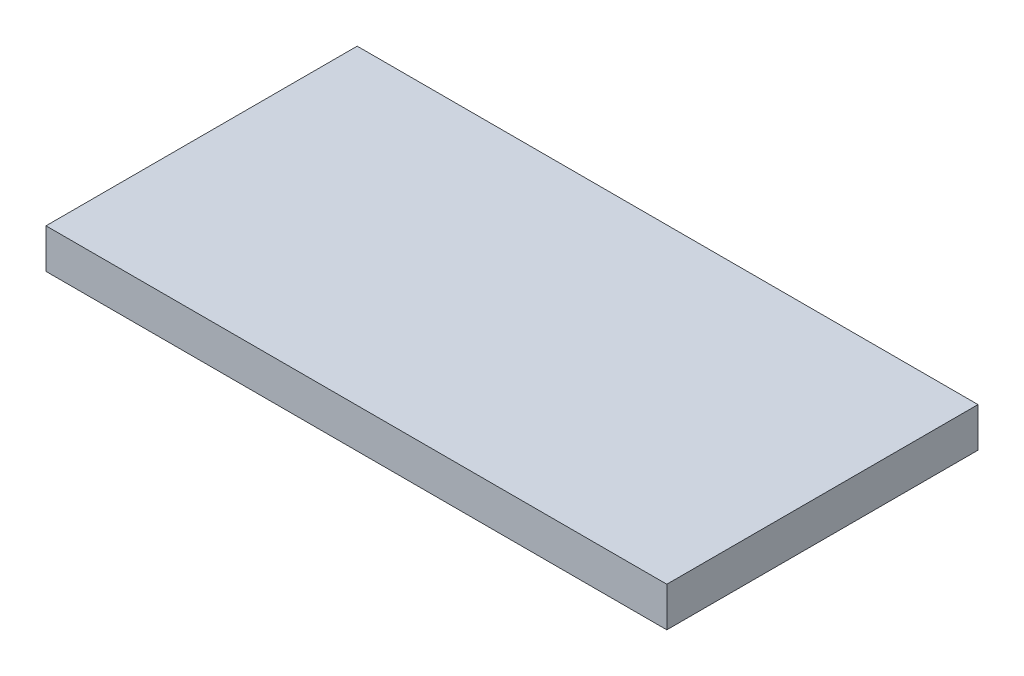
ISO-10303-21;
HEADER;
FILE_DESCRIPTION(('STEP AP214'),'2;1');
FILE_NAME('part.step','',(''),(''),'','','');
FILE_SCHEMA(('AUTOMOTIVE_DESIGN { 1 0 10303 214 1 1 1 1 }'));
ENDSEC;
DATA;
#1=APPLICATION_CONTEXT('core data for automotive mechanical design processes');
#2=APPLICATION_PROTOCOL_DEFINITION('international standard','automotive_design',2000,#1);
#3=PRODUCT_CONTEXT('',#1,'mechanical');
#4=PRODUCT('Part','Part','',(#3));
#5=PRODUCT_RELATED_PRODUCT_CATEGORY('part','',(#4));
#6=PRODUCT_DEFINITION_FORMATION('','',#4);
#7=PRODUCT_DEFINITION_CONTEXT('part definition',#1,'design');
#8=PRODUCT_DEFINITION('design','',#6,#7);
#9=PRODUCT_DEFINITION_SHAPE('','',#8);
#10=(LENGTH_UNIT() NAMED_UNIT(*) SI_UNIT(.MILLI.,.METRE.));
#11=(NAMED_UNIT(*) PLANE_ANGLE_UNIT() SI_UNIT($,.RADIAN.));
#12=(NAMED_UNIT(*) SI_UNIT($,.STERADIAN.) SOLID_ANGLE_UNIT());
#13=UNCERTAINTY_MEASURE_WITH_UNIT(LENGTH_MEASURE(1.E-05),#10,'distance_accuracy_value','');
#14=(GEOMETRIC_REPRESENTATION_CONTEXT(3) GLOBAL_UNCERTAINTY_ASSIGNED_CONTEXT((#13)) GLOBAL_UNIT_ASSIGNED_CONTEXT((#10,
#11,#12)) REPRESENTATION_CONTEXT('',''));
#15=CARTESIAN_POINT('',(0.,0.,0.));
#16=DIRECTION('',(0.,0.,1.));
#17=DIRECTION('',(1.,0.,0.));
#18=AXIS2_PLACEMENT_3D('',#15,#16,#17);
#19=CARTESIAN_POINT('',(399.,50.8,-200.));
#20=DIRECTION('',(-1.,0.,0.));
#21=DIRECTION('',(0.,0.,1.));
#22=AXIS2_PLACEMENT_3D('',#19,#20,#21);
#23=PLANE('',#22);
#24=DIRECTION('',(0.,0.,-1.));
#25=VECTOR('',#24,1.);
#26=CARTESIAN_POINT('',(399.,0.,-200.));
#27=LINE('',#26,#25);
#28=CARTESIAN_POINT('',(399.,0.,200.));
#29=VERTEX_POINT('',#28);
#30=CARTESIAN_POINT('',(399.,0.,-200.));
#31=VERTEX_POINT('',#30);
#32=EDGE_CURVE('E128',#29,#31,#27,.T.);
#33=ORIENTED_EDGE('',*,*,#32,.T.);
#34=DIRECTION('',(0.,-1.,0.));
#35=VECTOR('',#34,1.);
#36=CARTESIAN_POINT('',(399.,50.8,-200.));
#37=LINE('',#36,#35);
#38=CARTESIAN_POINT('',(399.,50.8,-200.));
#39=VERTEX_POINT('',#38);
#40=EDGE_CURVE('E11',#39,#31,#37,.T.);
#41=ORIENTED_EDGE('',*,*,#40,.F.);
#42=DIRECTION('',(0.,0.,-1.));
#43=VECTOR('',#42,1.);
#44=CARTESIAN_POINT('',(399.,50.8,-200.));
#45=LINE('',#44,#43);
#46=CARTESIAN_POINT('',(399.,50.8,200.));
#47=VERTEX_POINT('',#46);
#48=EDGE_CURVE('E148',#47,#39,#45,.T.);
#49=ORIENTED_EDGE('',*,*,#48,.F.);
#50=DIRECTION('',(0.,-1.,0.));
#51=VECTOR('',#50,1.);
#52=CARTESIAN_POINT('',(399.,50.8,200.));
#53=LINE('',#52,#51);
#54=EDGE_CURVE('E153',#47,#29,#53,.T.);
#55=ORIENTED_EDGE('',*,*,#54,.T.);
#56=EDGE_LOOP('',(#33,#41,#49,#55));
#57=FACE_BOUND('',#56,.T.);
#58=ADVANCED_FACE('F32',(#57),#23,.F.);
#59=CARTESIAN_POINT('',(-399.,50.8,-200.));
#60=DIRECTION('',(0.,0.,1.));
#61=DIRECTION('',(1.,0.,0.));
#62=AXIS2_PLACEMENT_3D('',#59,#60,#61);
#63=PLANE('',#62);
#64=DIRECTION('',(-1.,0.,0.));
#65=VECTOR('',#64,1.);
#66=CARTESIAN_POINT('',(-399.,0.,-200.));
#67=LINE('',#66,#65);
#68=CARTESIAN_POINT('',(-399.,0.,-200.));
#69=VERTEX_POINT('',#68);
#70=EDGE_CURVE('E132',#31,#69,#67,.T.);
#71=ORIENTED_EDGE('',*,*,#70,.T.);
#72=DIRECTION('',(0.,-1.,0.));
#73=VECTOR('',#72,1.);
#74=CARTESIAN_POINT('',(-399.,50.8,-200.));
#75=LINE('',#74,#73);
#76=CARTESIAN_POINT('',(-399.,50.8,-200.));
#77=VERTEX_POINT('',#76);
#78=EDGE_CURVE('E39',#77,#69,#75,.T.);
#79=ORIENTED_EDGE('',*,*,#78,.F.);
#80=DIRECTION('',(-1.,0.,0.));
#81=VECTOR('',#80,1.);
#82=CARTESIAN_POINT('',(-399.,50.8,-200.));
#83=LINE('',#82,#81);
#84=EDGE_CURVE('E83',#39,#77,#83,.T.);
#85=ORIENTED_EDGE('',*,*,#84,.F.);
#86=ORIENTED_EDGE('',*,*,#40,.T.);
#87=EDGE_LOOP('',(#71,#79,#85,#86));
#88=FACE_BOUND('',#87,.T.);
#89=ADVANCED_FACE('F182',(#88),#63,.F.);
#90=CARTESIAN_POINT('',(-399.,50.8,-200.));
#91=DIRECTION('',(1.,0.,0.));
#92=DIRECTION('',(0.,0.,-1.));
#93=AXIS2_PLACEMENT_3D('',#90,#91,#92);
#94=PLANE('',#93);
#95=DIRECTION('',(0.,0.,1.));
#96=VECTOR('',#95,1.);
#97=CARTESIAN_POINT('',(-399.,0.,-200.));
#98=LINE('',#97,#96);
#99=CARTESIAN_POINT('',(-399.,0.,200.));
#100=VERTEX_POINT('',#99);
#101=EDGE_CURVE('E156',#69,#100,#98,.T.);
#102=ORIENTED_EDGE('',*,*,#101,.T.);
#103=DIRECTION('',(0.,-1.,0.));
#104=VECTOR('',#103,1.);
#105=CARTESIAN_POINT('',(-399.,50.8,200.));
#106=LINE('',#105,#104);
#107=CARTESIAN_POINT('',(-399.,50.8,200.));
#108=VERTEX_POINT('',#107);
#109=EDGE_CURVE('E160',#108,#100,#106,.T.);
#110=ORIENTED_EDGE('',*,*,#109,.F.);
#111=DIRECTION('',(0.,0.,1.));
#112=VECTOR('',#111,1.);
#113=CARTESIAN_POINT('',(-399.,50.8,-200.));
#114=LINE('',#113,#112);
#115=EDGE_CURVE('E151',#77,#108,#114,.T.);
#116=ORIENTED_EDGE('',*,*,#115,.F.);
#117=ORIENTED_EDGE('',*,*,#78,.T.);
#118=EDGE_LOOP('',(#102,#110,#116,#117));
#119=FACE_BOUND('',#118,.T.);
#120=ADVANCED_FACE('F165',(#119),#94,.F.);
#121=CARTESIAN_POINT('',(-399.,50.8,200.));
#122=DIRECTION('',(0.,0.,-1.));
#123=DIRECTION('',(-1.,0.,0.));
#124=AXIS2_PLACEMENT_3D('',#121,#122,#123);
#125=PLANE('',#124);
#126=DIRECTION('',(1.,0.,0.));
#127=VECTOR('',#126,1.);
#128=CARTESIAN_POINT('',(-399.,0.,200.));
#129=LINE('',#128,#127);
#130=EDGE_CURVE('E76',#100,#29,#129,.T.);
#131=ORIENTED_EDGE('',*,*,#130,.T.);
#132=ORIENTED_EDGE('',*,*,#54,.F.);
#133=DIRECTION('',(1.,0.,0.));
#134=VECTOR('',#133,1.);
#135=CARTESIAN_POINT('',(-399.,50.8,200.));
#136=LINE('',#135,#134);
#137=EDGE_CURVE('E55',#108,#47,#136,.T.);
#138=ORIENTED_EDGE('',*,*,#137,.F.);
#139=ORIENTED_EDGE('',*,*,#109,.T.);
#140=EDGE_LOOP('',(#131,#132,#138,#139));
#141=FACE_BOUND('',#140,.T.);
#142=ADVANCED_FACE('F173',(#141),#125,.F.);
#143=CARTESIAN_POINT('',(0.,50.8,0.));
#144=DIRECTION('',(0.,1.,0.));
#145=DIRECTION('',(0.,0.,1.));
#146=AXIS2_PLACEMENT_3D('',#143,#144,#145);
#147=PLANE('',#146);
#148=ORIENTED_EDGE('',*,*,#48,.T.);
#149=ORIENTED_EDGE('',*,*,#84,.T.);
#150=ORIENTED_EDGE('',*,*,#115,.T.);
#151=ORIENTED_EDGE('',*,*,#137,.T.);
#152=EDGE_LOOP('',(#148,#149,#150,#151));
#153=FACE_BOUND('',#152,.T.);
#154=ADVANCED_FACE('F175',(#153),#147,.T.);
#155=CARTESIAN_POINT('',(0.,0.,0.));
#156=DIRECTION('',(0.,1.,0.));
#157=DIRECTION('',(0.,0.,1.));
#158=AXIS2_PLACEMENT_3D('',#155,#156,#157);
#159=PLANE('',#158);
#160=DIRECTION('',(1.,0.,0.));
#161=VECTOR('',#160,1.);
#162=CARTESIAN_POINT('',(-399.,0.,198.1));
#163=LINE('',#162,#161);
#164=CARTESIAN_POINT('',(-397.1,0.,198.1));
#165=VERTEX_POINT('',#164);
#166=CARTESIAN_POINT('',(397.1,0.,198.1));
#167=VERTEX_POINT('',#166);
#168=EDGE_CURVE('E123',#165,#167,#163,.T.);
#169=ORIENTED_EDGE('',*,*,#168,.T.);
#170=DIRECTION('',(0.,0.,-1.));
#171=VECTOR('',#170,1.);
#172=CARTESIAN_POINT('',(397.1,0.,-200.));
#173=LINE('',#172,#171);
#174=CARTESIAN_POINT('',(397.1,0.,-198.1));
#175=VERTEX_POINT('',#174);
#176=EDGE_CURVE('E142',#167,#175,#173,.T.);
#177=ORIENTED_EDGE('',*,*,#176,.T.);
#178=DIRECTION('',(-1.,0.,0.));
#179=VECTOR('',#178,1.);
#180=CARTESIAN_POINT('',(-399.,0.,-198.1));
#181=LINE('',#180,#179);
#182=CARTESIAN_POINT('',(-397.1,0.,-198.1));
#183=VERTEX_POINT('',#182);
#184=EDGE_CURVE('E127',#175,#183,#181,.T.);
#185=ORIENTED_EDGE('',*,*,#184,.T.);
#186=DIRECTION('',(0.,0.,1.));
#187=VECTOR('',#186,1.);
#188=CARTESIAN_POINT('',(-397.1,0.,-200.));
#189=LINE('',#188,#187);
#190=EDGE_CURVE('E46',#183,#165,#189,.T.);
#191=ORIENTED_EDGE('',*,*,#190,.T.);
#192=EDGE_LOOP('',(#169,#177,#185,#191));
#193=FACE_BOUND('',#192,.T.);
#194=ORIENTED_EDGE('',*,*,#32,.F.);
#195=ORIENTED_EDGE('',*,*,#130,.F.);
#196=ORIENTED_EDGE('',*,*,#101,.F.);
#197=ORIENTED_EDGE('',*,*,#70,.F.);
#198=EDGE_LOOP('',(#194,#195,#196,#197));
#199=FACE_BOUND('',#198,.T.);
#200=ADVANCED_FACE('F169',(#193,#199),#159,.F.);
#201=CARTESIAN_POINT('',(397.1,50.8,-200.));
#202=DIRECTION('',(-1.,0.,0.));
#203=DIRECTION('',(0.,0.,1.));
#204=AXIS2_PLACEMENT_3D('',#201,#202,#203);
#205=PLANE('',#204);
#206=ORIENTED_EDGE('',*,*,#176,.F.);
#207=DIRECTION('',(0.,-1.,0.));
#208=VECTOR('',#207,1.);
#209=CARTESIAN_POINT('',(397.1,50.8,198.1));
#210=LINE('',#209,#208);
#211=CARTESIAN_POINT('',(397.1,48.9,198.1));
#212=VERTEX_POINT('',#211);
#213=EDGE_CURVE('E122',#212,#167,#210,.T.);
#214=ORIENTED_EDGE('',*,*,#213,.F.);
#215=DIRECTION('',(0.,0.,-1.));
#216=VECTOR('',#215,1.);
#217=CARTESIAN_POINT('',(397.1,48.9,-200.));
#218=LINE('',#217,#216);
#219=CARTESIAN_POINT('',(397.1,48.9,-198.1));
#220=VERTEX_POINT('',#219);
#221=EDGE_CURVE('E110',#212,#220,#218,.T.);
#222=ORIENTED_EDGE('',*,*,#221,.T.);
#223=DIRECTION('',(0.,-1.,0.));
#224=VECTOR('',#223,1.);
#225=CARTESIAN_POINT('',(397.1,50.8,-198.1));
#226=LINE('',#225,#224);
#227=EDGE_CURVE('E120',#220,#175,#226,.T.);
#228=ORIENTED_EDGE('',*,*,#227,.T.);
#229=EDGE_LOOP('',(#206,#214,#222,#228));
#230=FACE_BOUND('',#229,.T.);
#231=ADVANCED_FACE('F119',(#230),#205,.T.);
#232=CARTESIAN_POINT('',(-399.,50.8,-198.1));
#233=DIRECTION('',(0.,0.,1.));
#234=DIRECTION('',(1.,0.,0.));
#235=AXIS2_PLACEMENT_3D('',#232,#233,#234);
#236=PLANE('',#235);
#237=ORIENTED_EDGE('',*,*,#184,.F.);
#238=ORIENTED_EDGE('',*,*,#227,.F.);
#239=DIRECTION('',(-1.,0.,0.));
#240=VECTOR('',#239,1.);
#241=CARTESIAN_POINT('',(-399.,48.9,-198.1));
#242=LINE('',#241,#240);
#243=CARTESIAN_POINT('',(-397.1,48.9,-198.1));
#244=VERTEX_POINT('',#243);
#245=EDGE_CURVE('E106',#220,#244,#242,.T.);
#246=ORIENTED_EDGE('',*,*,#245,.T.);
#247=DIRECTION('',(0.,-1.,0.));
#248=VECTOR('',#247,1.);
#249=CARTESIAN_POINT('',(-397.1,50.8,-198.1));
#250=LINE('',#249,#248);
#251=EDGE_CURVE('E129',#244,#183,#250,.T.);
#252=ORIENTED_EDGE('',*,*,#251,.T.);
#253=EDGE_LOOP('',(#237,#238,#246,#252));
#254=FACE_BOUND('',#253,.T.);
#255=ADVANCED_FACE('F125',(#254),#236,.T.);
#256=CARTESIAN_POINT('',(-397.1,50.8,-200.));
#257=DIRECTION('',(1.,0.,0.));
#258=DIRECTION('',(0.,0.,-1.));
#259=AXIS2_PLACEMENT_3D('',#256,#257,#258);
#260=PLANE('',#259);
#261=ORIENTED_EDGE('',*,*,#190,.F.);
#262=ORIENTED_EDGE('',*,*,#251,.F.);
#263=DIRECTION('',(0.,0.,1.));
#264=VECTOR('',#263,1.);
#265=CARTESIAN_POINT('',(-397.1,48.9,-200.));
#266=LINE('',#265,#264);
#267=CARTESIAN_POINT('',(-397.1,48.9,198.1));
#268=VERTEX_POINT('',#267);
#269=EDGE_CURVE('E111',#244,#268,#266,.T.);
#270=ORIENTED_EDGE('',*,*,#269,.T.);
#271=DIRECTION('',(0.,-1.,0.));
#272=VECTOR('',#271,1.);
#273=CARTESIAN_POINT('',(-397.1,50.8,198.1));
#274=LINE('',#273,#272);
#275=EDGE_CURVE('E134',#268,#165,#274,.T.);
#276=ORIENTED_EDGE('',*,*,#275,.T.);
#277=EDGE_LOOP('',(#261,#262,#270,#276));
#278=FACE_BOUND('',#277,.T.);
#279=ADVANCED_FACE('F230',(#278),#260,.T.);
#280=CARTESIAN_POINT('',(-399.,50.8,198.1));
#281=DIRECTION('',(0.,0.,-1.));
#282=DIRECTION('',(-1.,0.,0.));
#283=AXIS2_PLACEMENT_3D('',#280,#281,#282);
#284=PLANE('',#283);
#285=ORIENTED_EDGE('',*,*,#168,.F.);
#286=ORIENTED_EDGE('',*,*,#275,.F.);
#287=DIRECTION('',(1.,0.,0.));
#288=VECTOR('',#287,1.);
#289=CARTESIAN_POINT('',(-399.,48.9,198.1));
#290=LINE('',#289,#288);
#291=EDGE_CURVE('E137',#268,#212,#290,.T.);
#292=ORIENTED_EDGE('',*,*,#291,.T.);
#293=ORIENTED_EDGE('',*,*,#213,.T.);
#294=EDGE_LOOP('',(#285,#286,#292,#293));
#295=FACE_BOUND('',#294,.T.);
#296=ADVANCED_FACE('F239',(#295),#284,.T.);
#297=CARTESIAN_POINT('',(0.,48.9,0.));
#298=DIRECTION('',(0.,1.,0.));
#299=DIRECTION('',(0.,0.,1.));
#300=AXIS2_PLACEMENT_3D('',#297,#298,#299);
#301=PLANE('',#300);
#302=ORIENTED_EDGE('',*,*,#221,.F.);
#303=ORIENTED_EDGE('',*,*,#291,.F.);
#304=ORIENTED_EDGE('',*,*,#269,.F.);
#305=ORIENTED_EDGE('',*,*,#245,.F.);
#306=EDGE_LOOP('',(#302,#303,#304,#305));
#307=FACE_BOUND('',#306,.T.);
#308=ADVANCED_FACE('F108',(#307),#301,.F.);
#309=CLOSED_SHELL('',(#58,#89,#120,#142,#154,#200,#231,#255,#279,#296,#308));
#310=MANIFOLD_SOLID_BREP('B2',#309);
#311=ADVANCED_BREP_SHAPE_REPRESENTATION('',(#18,#310),#14);
#312=SHAPE_DEFINITION_REPRESENTATION(#9,#311);
ENDSEC;
END-ISO-10303-21;
